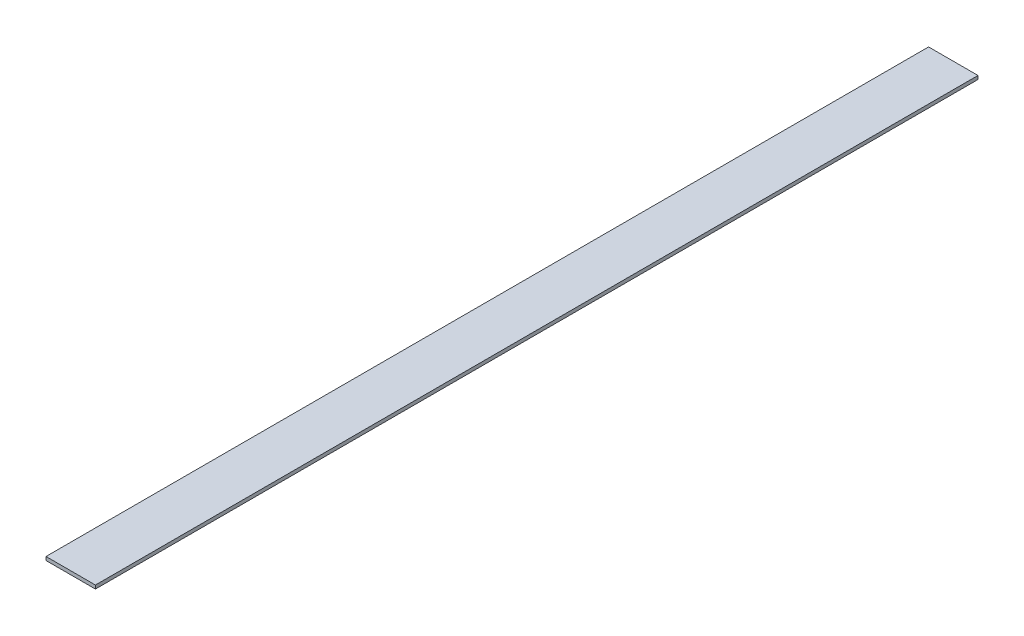
ISO-10303-21;
HEADER;
FILE_DESCRIPTION(('STEP AP214'),'2;1');
FILE_NAME('part.step','',(''),(''),'','','');
FILE_SCHEMA(('AUTOMOTIVE_DESIGN { 1 0 10303 214 1 1 1 1 }'));
ENDSEC;
DATA;
#1=APPLICATION_CONTEXT('core data for automotive mechanical design processes');
#2=APPLICATION_PROTOCOL_DEFINITION('international standard','automotive_design',2000,#1);
#3=PRODUCT_CONTEXT('',#1,'mechanical');
#4=PRODUCT('Part','Part','',(#3));
#5=PRODUCT_RELATED_PRODUCT_CATEGORY('part','',(#4));
#6=PRODUCT_DEFINITION_FORMATION('','',#4);
#7=PRODUCT_DEFINITION_CONTEXT('part definition',#1,'design');
#8=PRODUCT_DEFINITION('design','',#6,#7);
#9=PRODUCT_DEFINITION_SHAPE('','',#8);
#10=(LENGTH_UNIT() NAMED_UNIT(*) SI_UNIT(.MILLI.,.METRE.));
#11=(NAMED_UNIT(*) PLANE_ANGLE_UNIT() SI_UNIT($,.RADIAN.));
#12=(NAMED_UNIT(*) SI_UNIT($,.STERADIAN.) SOLID_ANGLE_UNIT());
#13=UNCERTAINTY_MEASURE_WITH_UNIT(LENGTH_MEASURE(1.E-05),#10,'distance_accuracy_value','');
#14=(GEOMETRIC_REPRESENTATION_CONTEXT(3) GLOBAL_UNCERTAINTY_ASSIGNED_CONTEXT((#13)) GLOBAL_UNIT_ASSIGNED_CONTEXT((#10,
#11,#12)) REPRESENTATION_CONTEXT('',''));
#15=CARTESIAN_POINT('',(0.,0.,0.));
#16=DIRECTION('',(0.,0.,1.));
#17=DIRECTION('',(1.,0.,0.));
#18=AXIS2_PLACEMENT_3D('',#15,#16,#17);
#19=CARTESIAN_POINT('',(0.,0.,2500.));
#20=DIRECTION('',(1.,0.,0.));
#21=DIRECTION('',(0.,0.,-1.));
#22=AXIS2_PLACEMENT_3D('',#19,#20,#21);
#23=PLANE('',#22);
#24=DIRECTION('',(0.,-1.,0.));
#25=VECTOR('',#24,1.);
#26=CARTESIAN_POINT('',(0.,0.,0.));
#27=LINE('',#26,#25);
#28=CARTESIAN_POINT('',(0.,0.,0.));
#29=VERTEX_POINT('',#28);
#30=CARTESIAN_POINT('',(0.,-10.,0.));
#31=VERTEX_POINT('',#30);
#32=EDGE_CURVE('E107',#29,#31,#27,.T.);
#33=ORIENTED_EDGE('',*,*,#32,.T.);
#34=DIRECTION('',(0.,0.,-1.));
#35=VECTOR('',#34,1.);
#36=CARTESIAN_POINT('',(0.,-10.,2500.));
#37=LINE('',#36,#35);
#38=CARTESIAN_POINT('',(0.,-10.,2500.));
#39=VERTEX_POINT('',#38);
#40=EDGE_CURVE('E11',#39,#31,#37,.T.);
#41=ORIENTED_EDGE('',*,*,#40,.F.);
#42=DIRECTION('',(0.,-1.,0.));
#43=VECTOR('',#42,1.);
#44=CARTESIAN_POINT('',(0.,0.,2500.));
#45=LINE('',#44,#43);
#46=CARTESIAN_POINT('',(0.,0.,2500.));
#47=VERTEX_POINT('',#46);
#48=EDGE_CURVE('E91',#47,#39,#45,.T.);
#49=ORIENTED_EDGE('',*,*,#48,.F.);
#50=DIRECTION('',(0.,0.,-1.));
#51=VECTOR('',#50,1.);
#52=CARTESIAN_POINT('',(0.,0.,2500.));
#53=LINE('',#52,#51);
#54=EDGE_CURVE('E103',#47,#29,#53,.T.);
#55=ORIENTED_EDGE('',*,*,#54,.T.);
#56=EDGE_LOOP('',(#33,#41,#49,#55));
#57=FACE_BOUND('',#56,.T.);
#58=ADVANCED_FACE('F39',(#57),#23,.F.);
#59=CARTESIAN_POINT('',(0.,-10.,2500.));
#60=DIRECTION('',(0.,1.,0.));
#61=DIRECTION('',(0.,0.,1.));
#62=AXIS2_PLACEMENT_3D('',#59,#60,#61);
#63=PLANE('',#62);
#64=DIRECTION('',(1.,0.,0.));
#65=VECTOR('',#64,1.);
#66=CARTESIAN_POINT('',(0.,-10.,0.));
#67=LINE('',#66,#65);
#68=CARTESIAN_POINT('',(140.,-10.,0.));
#69=VERTEX_POINT('',#68);
#70=EDGE_CURVE('E96',#31,#69,#67,.T.);
#71=ORIENTED_EDGE('',*,*,#70,.T.);
#72=DIRECTION('',(0.,0.,-1.));
#73=VECTOR('',#72,1.);
#74=CARTESIAN_POINT('',(140.,-10.,2500.));
#75=LINE('',#74,#73);
#76=CARTESIAN_POINT('',(140.,-10.,2500.));
#77=VERTEX_POINT('',#76);
#78=EDGE_CURVE('E48',#77,#69,#75,.T.);
#79=ORIENTED_EDGE('',*,*,#78,.F.);
#80=DIRECTION('',(1.,0.,0.));
#81=VECTOR('',#80,1.);
#82=CARTESIAN_POINT('',(0.,-10.,2500.));
#83=LINE('',#82,#81);
#84=EDGE_CURVE('E86',#39,#77,#83,.T.);
#85=ORIENTED_EDGE('',*,*,#84,.F.);
#86=ORIENTED_EDGE('',*,*,#40,.T.);
#87=EDGE_LOOP('',(#71,#79,#85,#86));
#88=FACE_BOUND('',#87,.T.);
#89=ADVANCED_FACE('F95',(#88),#63,.F.);
#90=CARTESIAN_POINT('',(140.,0.,2500.));
#91=DIRECTION('',(-1.,0.,0.));
#92=DIRECTION('',(0.,0.,1.));
#93=AXIS2_PLACEMENT_3D('',#90,#91,#92);
#94=PLANE('',#93);
#95=DIRECTION('',(0.,1.,0.));
#96=VECTOR('',#95,1.);
#97=CARTESIAN_POINT('',(140.,0.,0.));
#98=LINE('',#97,#96);
#99=CARTESIAN_POINT('',(140.,0.,0.));
#100=VERTEX_POINT('',#99);
#101=EDGE_CURVE('E73',#69,#100,#98,.T.);
#102=ORIENTED_EDGE('',*,*,#101,.T.);
#103=DIRECTION('',(0.,0.,-1.));
#104=VECTOR('',#103,1.);
#105=CARTESIAN_POINT('',(140.,0.,2500.));
#106=LINE('',#105,#104);
#107=CARTESIAN_POINT('',(140.,0.,2500.));
#108=VERTEX_POINT('',#107);
#109=EDGE_CURVE('E98',#108,#100,#106,.T.);
#110=ORIENTED_EDGE('',*,*,#109,.F.);
#111=DIRECTION('',(0.,1.,0.));
#112=VECTOR('',#111,1.);
#113=CARTESIAN_POINT('',(140.,0.,2500.));
#114=LINE('',#113,#112);
#115=EDGE_CURVE('E89',#77,#108,#114,.T.);
#116=ORIENTED_EDGE('',*,*,#115,.F.);
#117=ORIENTED_EDGE('',*,*,#78,.T.);
#118=EDGE_LOOP('',(#102,#110,#116,#117));
#119=FACE_BOUND('',#118,.T.);
#120=ADVANCED_FACE('F99',(#119),#94,.F.);
#121=CARTESIAN_POINT('',(0.,0.,2500.));
#122=DIRECTION('',(0.,-1.,0.));
#123=DIRECTION('',(0.,0.,-1.));
#124=AXIS2_PLACEMENT_3D('',#121,#122,#123);
#125=PLANE('',#124);
#126=DIRECTION('',(-1.,0.,0.));
#127=VECTOR('',#126,1.);
#128=CARTESIAN_POINT('',(0.,0.,0.));
#129=LINE('',#128,#127);
#130=EDGE_CURVE('E79',#100,#29,#129,.T.);
#131=ORIENTED_EDGE('',*,*,#130,.T.);
#132=ORIENTED_EDGE('',*,*,#54,.F.);
#133=DIRECTION('',(-1.,0.,0.));
#134=VECTOR('',#133,1.);
#135=CARTESIAN_POINT('',(0.,0.,2500.));
#136=LINE('',#135,#134);
#137=EDGE_CURVE('E56',#108,#47,#136,.T.);
#138=ORIENTED_EDGE('',*,*,#137,.F.);
#139=ORIENTED_EDGE('',*,*,#109,.T.);
#140=EDGE_LOOP('',(#131,#132,#138,#139));
#141=FACE_BOUND('',#140,.T.);
#142=ADVANCED_FACE('F120',(#141),#125,.F.);
#143=CARTESIAN_POINT('',(0.,0.,2500.));
#144=DIRECTION('',(0.,0.,1.));
#145=DIRECTION('',(1.,0.,0.));
#146=AXIS2_PLACEMENT_3D('',#143,#144,#145);
#147=PLANE('',#146);
#148=ORIENTED_EDGE('',*,*,#48,.T.);
#149=ORIENTED_EDGE('',*,*,#84,.T.);
#150=ORIENTED_EDGE('',*,*,#115,.T.);
#151=ORIENTED_EDGE('',*,*,#137,.T.);
#152=EDGE_LOOP('',(#148,#149,#150,#151));
#153=FACE_BOUND('',#152,.T.);
#154=ADVANCED_FACE('F87',(#153),#147,.T.);
#155=CARTESIAN_POINT('',(0.,0.,0.));
#156=DIRECTION('',(0.,0.,1.));
#157=DIRECTION('',(1.,0.,0.));
#158=AXIS2_PLACEMENT_3D('',#155,#156,#157);
#159=PLANE('',#158);
#160=ORIENTED_EDGE('',*,*,#32,.F.);
#161=ORIENTED_EDGE('',*,*,#130,.F.);
#162=ORIENTED_EDGE('',*,*,#101,.F.);
#163=ORIENTED_EDGE('',*,*,#70,.F.);
#164=EDGE_LOOP('',(#160,#161,#162,#163));
#165=FACE_BOUND('',#164,.T.);
#166=ADVANCED_FACE('F123',(#165),#159,.F.);
#167=CLOSED_SHELL('',(#58,#89,#120,#142,#154,#166));
#168=MANIFOLD_SOLID_BREP('B2',#167);
#169=ADVANCED_BREP_SHAPE_REPRESENTATION('',(#18,#168),#14);
#170=SHAPE_DEFINITION_REPRESENTATION(#9,#169);
ENDSEC;
END-ISO-10303-21;
